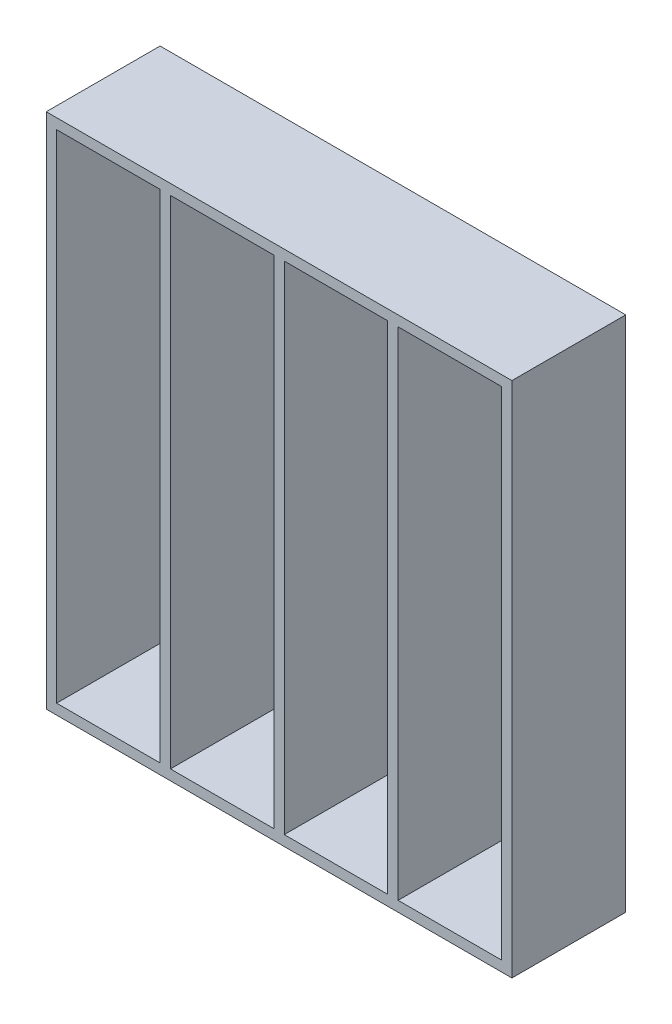
ISO-10303-21;
HEADER;
FILE_DESCRIPTION(('STEP AP214'),'2;1');
FILE_NAME('part.step','',(''),(''),'','','');
FILE_SCHEMA(('AUTOMOTIVE_DESIGN { 1 0 10303 214 1 1 1 1 }'));
ENDSEC;
DATA;
#1=APPLICATION_CONTEXT('core data for automotive mechanical design processes');
#2=APPLICATION_PROTOCOL_DEFINITION('international standard','automotive_design',2000,#1);
#3=PRODUCT_CONTEXT('',#1,'mechanical');
#4=PRODUCT('Part','Part','',(#3));
#5=PRODUCT_RELATED_PRODUCT_CATEGORY('part','',(#4));
#6=PRODUCT_DEFINITION_FORMATION('','',#4);
#7=PRODUCT_DEFINITION_CONTEXT('part definition',#1,'design');
#8=PRODUCT_DEFINITION('design','',#6,#7);
#9=PRODUCT_DEFINITION_SHAPE('','',#8);
#10=(LENGTH_UNIT() NAMED_UNIT(*) SI_UNIT(.MILLI.,.METRE.));
#11=(NAMED_UNIT(*) PLANE_ANGLE_UNIT() SI_UNIT($,.RADIAN.));
#12=(NAMED_UNIT(*) SI_UNIT($,.STERADIAN.) SOLID_ANGLE_UNIT());
#13=UNCERTAINTY_MEASURE_WITH_UNIT(LENGTH_MEASURE(1.E-05),#10,'distance_accuracy_value','');
#14=(GEOMETRIC_REPRESENTATION_CONTEXT(3) GLOBAL_UNCERTAINTY_ASSIGNED_CONTEXT((#13)) GLOBAL_UNIT_ASSIGNED_CONTEXT((#10,
#11,#12)) REPRESENTATION_CONTEXT('',''));
#15=CARTESIAN_POINT('',(0.,0.,0.));
#16=DIRECTION('',(0.,0.,1.));
#17=DIRECTION('',(1.,0.,0.));
#18=AXIS2_PLACEMENT_3D('',#15,#16,#17);
#19=CARTESIAN_POINT('',(0.,0.,11.));
#20=DIRECTION('',(-1.,0.,0.));
#21=DIRECTION('',(0.,0.,1.));
#22=AXIS2_PLACEMENT_3D('',#19,#20,#21);
#23=PLANE('',#22);
#24=DIRECTION('',(0.,1.,0.));
#25=VECTOR('',#24,1.);
#26=CARTESIAN_POINT('',(0.,0.,0.));
#27=LINE('',#26,#25);
#28=CARTESIAN_POINT('',(0.,0.,0.));
#29=VERTEX_POINT('',#28);
#30=CARTESIAN_POINT('',(0.,50.,0.));
#31=VERTEX_POINT('',#30);
#32=EDGE_CURVE('E293',#29,#31,#27,.T.);
#33=ORIENTED_EDGE('',*,*,#32,.T.);
#34=DIRECTION('',(0.,0.,-1.));
#35=VECTOR('',#34,1.);
#36=CARTESIAN_POINT('',(0.,50.,11.));
#37=LINE('',#36,#35);
#38=CARTESIAN_POINT('',(0.,50.,11.));
#39=VERTEX_POINT('',#38);
#40=EDGE_CURVE('E11',#39,#31,#37,.T.);
#41=ORIENTED_EDGE('',*,*,#40,.F.);
#42=DIRECTION('',(0.,1.,0.));
#43=VECTOR('',#42,1.);
#44=CARTESIAN_POINT('',(0.,0.,11.));
#45=LINE('',#44,#43);
#46=CARTESIAN_POINT('',(0.,0.,11.));
#47=VERTEX_POINT('',#46);
#48=EDGE_CURVE('E300',#47,#39,#45,.T.);
#49=ORIENTED_EDGE('',*,*,#48,.F.);
#50=DIRECTION('',(0.,0.,-1.));
#51=VECTOR('',#50,1.);
#52=CARTESIAN_POINT('',(0.,0.,11.));
#53=LINE('',#52,#51);
#54=EDGE_CURVE('E310',#47,#29,#53,.T.);
#55=ORIENTED_EDGE('',*,*,#54,.T.);
#56=EDGE_LOOP('',(#33,#41,#49,#55));
#57=FACE_BOUND('',#56,.T.);
#58=ADVANCED_FACE('F31',(#57),#23,.F.);
#59=CARTESIAN_POINT('',(0.,50.,11.));
#60=DIRECTION('',(0.,-1.,0.));
#61=DIRECTION('',(1.,0.,0.));
#62=AXIS2_PLACEMENT_3D('',#59,#60,#61);
#63=PLANE('',#62);
#64=DIRECTION('',(-1.,0.,0.));
#65=VECTOR('',#64,1.);
#66=CARTESIAN_POINT('',(0.,50.,0.));
#67=LINE('',#66,#65);
#68=CARTESIAN_POINT('',(-45.,50.,0.));
#69=VERTEX_POINT('',#68);
#70=EDGE_CURVE('E313',#31,#69,#67,.T.);
#71=ORIENTED_EDGE('',*,*,#70,.T.);
#72=DIRECTION('',(0.,0.,-1.));
#73=VECTOR('',#72,1.);
#74=CARTESIAN_POINT('',(-45.,50.,11.));
#75=LINE('',#74,#73);
#76=CARTESIAN_POINT('',(-45.,50.,11.));
#77=VERTEX_POINT('',#76);
#78=EDGE_CURVE('E38',#77,#69,#75,.T.);
#79=ORIENTED_EDGE('',*,*,#78,.F.);
#80=DIRECTION('',(-1.,0.,0.));
#81=VECTOR('',#80,1.);
#82=CARTESIAN_POINT('',(0.,50.,11.));
#83=LINE('',#82,#81);
#84=EDGE_CURVE('E303',#39,#77,#83,.T.);
#85=ORIENTED_EDGE('',*,*,#84,.F.);
#86=ORIENTED_EDGE('',*,*,#40,.T.);
#87=EDGE_LOOP('',(#71,#79,#85,#86));
#88=FACE_BOUND('',#87,.T.);
#89=ADVANCED_FACE('F343',(#88),#63,.F.);
#90=CARTESIAN_POINT('',(-45.,0.,11.));
#91=DIRECTION('',(1.,0.,0.));
#92=DIRECTION('',(0.,0.,-1.));
#93=AXIS2_PLACEMENT_3D('',#90,#91,#92);
#94=PLANE('',#93);
#95=DIRECTION('',(0.,-1.,0.));
#96=VECTOR('',#95,1.);
#97=CARTESIAN_POINT('',(-45.,0.,0.));
#98=LINE('',#97,#96);
#99=CARTESIAN_POINT('',(-45.,0.,0.));
#100=VERTEX_POINT('',#99);
#101=EDGE_CURVE('E315',#69,#100,#98,.T.);
#102=ORIENTED_EDGE('',*,*,#101,.T.);
#103=DIRECTION('',(0.,0.,-1.));
#104=VECTOR('',#103,1.);
#105=CARTESIAN_POINT('',(-45.,0.,11.));
#106=LINE('',#105,#104);
#107=CARTESIAN_POINT('',(-45.,0.,11.));
#108=VERTEX_POINT('',#107);
#109=EDGE_CURVE('E320',#108,#100,#106,.T.);
#110=ORIENTED_EDGE('',*,*,#109,.F.);
#111=DIRECTION('',(0.,-1.,0.));
#112=VECTOR('',#111,1.);
#113=CARTESIAN_POINT('',(-45.,0.,11.));
#114=LINE('',#113,#112);
#115=EDGE_CURVE('E306',#77,#108,#114,.T.);
#116=ORIENTED_EDGE('',*,*,#115,.F.);
#117=ORIENTED_EDGE('',*,*,#78,.T.);
#118=EDGE_LOOP('',(#102,#110,#116,#117));
#119=FACE_BOUND('',#118,.T.);
#120=ADVANCED_FACE('F327',(#119),#94,.F.);
#121=CARTESIAN_POINT('',(0.,0.,11.));
#122=DIRECTION('',(0.,1.,0.));
#123=DIRECTION('',(-1.,0.,0.));
#124=AXIS2_PLACEMENT_3D('',#121,#122,#123);
#125=PLANE('',#124);
#126=DIRECTION('',(1.,0.,0.));
#127=VECTOR('',#126,1.);
#128=CARTESIAN_POINT('',(0.,0.,0.));
#129=LINE('',#128,#127);
#130=EDGE_CURVE('E304',#100,#29,#129,.T.);
#131=ORIENTED_EDGE('',*,*,#130,.T.);
#132=ORIENTED_EDGE('',*,*,#54,.F.);
#133=DIRECTION('',(1.,0.,0.));
#134=VECTOR('',#133,1.);
#135=CARTESIAN_POINT('',(0.,0.,11.));
#136=LINE('',#135,#134);
#137=EDGE_CURVE('E308',#108,#47,#136,.T.);
#138=ORIENTED_EDGE('',*,*,#137,.F.);
#139=ORIENTED_EDGE('',*,*,#109,.T.);
#140=EDGE_LOOP('',(#131,#132,#138,#139));
#141=FACE_BOUND('',#140,.T.);
#142=ADVANCED_FACE('F336',(#141),#125,.F.);
#143=CARTESIAN_POINT('',(0.,0.,11.));
#144=DIRECTION('',(0.,0.,1.));
#145=DIRECTION('',(1.,0.,0.));
#146=AXIS2_PLACEMENT_3D('',#143,#144,#145);
#147=PLANE('',#146);
#148=DIRECTION('',(0.,-1.,0.));
#149=VECTOR('',#148,1.);
#150=CARTESIAN_POINT('',(-11.,49.,11.));
#151=LINE('',#150,#149);
#152=CARTESIAN_POINT('',(-11.,49.,11.));
#153=VERTEX_POINT('',#152);
#154=CARTESIAN_POINT('',(-11.,0.999999999999995,11.));
#155=VERTEX_POINT('',#154);
#156=EDGE_CURVE('E45',#153,#155,#151,.T.);
#157=ORIENTED_EDGE('',*,*,#156,.F.);
#158=DIRECTION('',(-1.,0.,0.));
#159=VECTOR('',#158,1.);
#160=CARTESIAN_POINT('',(-11.,49.,11.));
#161=LINE('',#160,#159);
#162=CARTESIAN_POINT('',(-0.999999999999992,49.,11.));
#163=VERTEX_POINT('',#162);
#164=EDGE_CURVE('E187',#163,#153,#161,.T.);
#165=ORIENTED_EDGE('',*,*,#164,.F.);
#166=DIRECTION('',(0.,1.,0.));
#167=VECTOR('',#166,1.);
#168=CARTESIAN_POINT('',(-0.999999999999992,49.,11.));
#169=LINE('',#168,#167);
#170=CARTESIAN_POINT('',(-0.999999999999987,0.999999999999994,11.));
#171=VERTEX_POINT('',#170);
#172=EDGE_CURVE('E190',#171,#163,#169,.T.);
#173=ORIENTED_EDGE('',*,*,#172,.F.);
#174=DIRECTION('',(1.,0.,0.));
#175=VECTOR('',#174,1.);
#176=CARTESIAN_POINT('',(-11.,0.999999999999995,11.));
#177=LINE('',#176,#175);
#178=EDGE_CURVE('E196',#155,#171,#177,.T.);
#179=ORIENTED_EDGE('',*,*,#178,.F.);
#180=EDGE_LOOP('',(#157,#165,#173,#179));
#181=FACE_BOUND('',#180,.T.);
#182=DIRECTION('',(0.,-1.,0.));
#183=VECTOR('',#182,1.);
#184=CARTESIAN_POINT('',(-22.,49.,11.));
#185=LINE('',#184,#183);
#186=CARTESIAN_POINT('',(-22.,49.,11.));
#187=VERTEX_POINT('',#186);
#188=CARTESIAN_POINT('',(-22.,0.999999999999995,11.));
#189=VERTEX_POINT('',#188);
#190=EDGE_CURVE('E53',#187,#189,#185,.T.);
#191=ORIENTED_EDGE('',*,*,#190,.F.);
#192=DIRECTION('',(-1.,0.,0.));
#193=VECTOR('',#192,1.);
#194=CARTESIAN_POINT('',(-22.,49.,11.));
#195=LINE('',#194,#193);
#196=CARTESIAN_POINT('',(-12.,49.,11.));
#197=VERTEX_POINT('',#196);
#198=EDGE_CURVE('E209',#197,#187,#195,.T.);
#199=ORIENTED_EDGE('',*,*,#198,.F.);
#200=DIRECTION('',(0.,1.,0.));
#201=VECTOR('',#200,1.);
#202=CARTESIAN_POINT('',(-12.,49.,11.));
#203=LINE('',#202,#201);
#204=CARTESIAN_POINT('',(-12.,0.999999999999995,11.));
#205=VERTEX_POINT('',#204);
#206=EDGE_CURVE('E223',#205,#197,#203,.T.);
#207=ORIENTED_EDGE('',*,*,#206,.F.);
#208=DIRECTION('',(1.,0.,0.));
#209=VECTOR('',#208,1.);
#210=CARTESIAN_POINT('',(-22.,0.999999999999995,11.));
#211=LINE('',#210,#209);
#212=EDGE_CURVE('E220',#189,#205,#211,.T.);
#213=ORIENTED_EDGE('',*,*,#212,.F.);
#214=EDGE_LOOP('',(#191,#199,#207,#213));
#215=FACE_BOUND('',#214,.T.);
#216=DIRECTION('',(0.,-1.,0.));
#217=VECTOR('',#216,1.);
#218=CARTESIAN_POINT('',(-33.,49.,11.));
#219=LINE('',#218,#217);
#220=CARTESIAN_POINT('',(-33.,49.,11.));
#221=VERTEX_POINT('',#220);
#222=CARTESIAN_POINT('',(-33.,0.999999999999994,11.));
#223=VERTEX_POINT('',#222);
#224=EDGE_CURVE('E230',#221,#223,#219,.T.);
#225=ORIENTED_EDGE('',*,*,#224,.F.);
#226=DIRECTION('',(-1.,0.,0.));
#227=VECTOR('',#226,1.);
#228=CARTESIAN_POINT('',(-33.,49.,11.));
#229=LINE('',#228,#227);
#230=CARTESIAN_POINT('',(-23.,49.,11.));
#231=VERTEX_POINT('',#230);
#232=EDGE_CURVE('E240',#231,#221,#229,.T.);
#233=ORIENTED_EDGE('',*,*,#232,.F.);
#234=DIRECTION('',(0.,1.,0.));
#235=VECTOR('',#234,1.);
#236=CARTESIAN_POINT('',(-23.,49.,11.));
#237=LINE('',#236,#235);
#238=CARTESIAN_POINT('',(-23.,0.999999999999995,11.));
#239=VERTEX_POINT('',#238);
#240=EDGE_CURVE('E254',#239,#231,#237,.T.);
#241=ORIENTED_EDGE('',*,*,#240,.F.);
#242=DIRECTION('',(1.,0.,0.));
#243=VECTOR('',#242,1.);
#244=CARTESIAN_POINT('',(-33.,0.999999999999994,11.));
#245=LINE('',#244,#243);
#246=EDGE_CURVE('E251',#223,#239,#245,.T.);
#247=ORIENTED_EDGE('',*,*,#246,.F.);
#248=EDGE_LOOP('',(#225,#233,#241,#247));
#249=FACE_BOUND('',#248,.T.);
#250=DIRECTION('',(0.,-1.,0.));
#251=VECTOR('',#250,1.);
#252=CARTESIAN_POINT('',(-44.,49.,11.));
#253=LINE('',#252,#251);
#254=CARTESIAN_POINT('',(-44.,49.,11.));
#255=VERTEX_POINT('',#254);
#256=CARTESIAN_POINT('',(-44.,0.999999999999994,11.));
#257=VERTEX_POINT('',#256);
#258=EDGE_CURVE('E261',#255,#257,#253,.T.);
#259=ORIENTED_EDGE('',*,*,#258,.F.);
#260=DIRECTION('',(-1.,0.,0.));
#261=VECTOR('',#260,1.);
#262=CARTESIAN_POINT('',(-44.,49.,11.));
#263=LINE('',#262,#261);
#264=CARTESIAN_POINT('',(-34.,49.,11.));
#265=VERTEX_POINT('',#264);
#266=EDGE_CURVE('E272',#265,#255,#263,.T.);
#267=ORIENTED_EDGE('',*,*,#266,.F.);
#268=DIRECTION('',(0.,1.,0.));
#269=VECTOR('',#268,1.);
#270=CARTESIAN_POINT('',(-34.,49.,11.));
#271=LINE('',#270,#269);
#272=CARTESIAN_POINT('',(-34.,0.999999999999995,11.));
#273=VERTEX_POINT('',#272);
#274=EDGE_CURVE('E286',#273,#265,#271,.T.);
#275=ORIENTED_EDGE('',*,*,#274,.F.);
#276=DIRECTION('',(1.,0.,0.));
#277=VECTOR('',#276,1.);
#278=CARTESIAN_POINT('',(-44.,0.999999999999994,11.));
#279=LINE('',#278,#277);
#280=EDGE_CURVE('E283',#257,#273,#279,.T.);
#281=ORIENTED_EDGE('',*,*,#280,.F.);
#282=EDGE_LOOP('',(#259,#267,#275,#281));
#283=FACE_BOUND('',#282,.T.);
#284=ORIENTED_EDGE('',*,*,#48,.T.);
#285=ORIENTED_EDGE('',*,*,#84,.T.);
#286=ORIENTED_EDGE('',*,*,#115,.T.);
#287=ORIENTED_EDGE('',*,*,#137,.T.);
#288=EDGE_LOOP('',(#284,#285,#286,#287));
#289=FACE_BOUND('',#288,.T.);
#290=ADVANCED_FACE('F342',(#181,#215,#249,#283,#289),#147,.T.);
#291=CARTESIAN_POINT('',(0.,0.,0.));
#292=DIRECTION('',(0.,0.,1.));
#293=DIRECTION('',(1.,0.,0.));
#294=AXIS2_PLACEMENT_3D('',#291,#292,#293);
#295=PLANE('',#294);
#296=ORIENTED_EDGE('',*,*,#32,.F.);
#297=ORIENTED_EDGE('',*,*,#130,.F.);
#298=ORIENTED_EDGE('',*,*,#101,.F.);
#299=ORIENTED_EDGE('',*,*,#70,.F.);
#300=EDGE_LOOP('',(#296,#297,#298,#299));
#301=FACE_BOUND('',#300,.T.);
#302=ADVANCED_FACE('F333',(#301),#295,.F.);
#303=CARTESIAN_POINT('',(-44.,49.,0.999999999999999));
#304=DIRECTION('',(-1.,0.,0.));
#305=DIRECTION('',(0.,-1.,0.));
#306=AXIS2_PLACEMENT_3D('',#303,#304,#305);
#307=PLANE('',#306);
#308=ORIENTED_EDGE('',*,*,#258,.T.);
#309=DIRECTION('',(0.,0.,1.));
#310=VECTOR('',#309,1.);
#311=CARTESIAN_POINT('',(-44.,0.999999999999994,0.999999999999999));
#312=LINE('',#311,#310);
#313=CARTESIAN_POINT('',(-44.,0.999999999999994,0.999999999999999));
#314=VERTEX_POINT('',#313);
#315=EDGE_CURVE('E281',#314,#257,#312,.T.);
#316=ORIENTED_EDGE('',*,*,#315,.F.);
#317=DIRECTION('',(0.,-1.,0.));
#318=VECTOR('',#317,1.);
#319=CARTESIAN_POINT('',(-44.,49.,0.999999999999999));
#320=LINE('',#319,#318);
#321=CARTESIAN_POINT('',(-44.,49.,0.999999999999999));
#322=VERTEX_POINT('',#321);
#323=EDGE_CURVE('E268',#322,#314,#320,.T.);
#324=ORIENTED_EDGE('',*,*,#323,.F.);
#325=DIRECTION('',(0.,0.,1.));
#326=VECTOR('',#325,1.);
#327=CARTESIAN_POINT('',(-44.,49.,0.999999999999999));
#328=LINE('',#327,#326);
#329=EDGE_CURVE('E291',#322,#255,#328,.T.);
#330=ORIENTED_EDGE('',*,*,#329,.T.);
#331=EDGE_LOOP('',(#308,#316,#324,#330));
#332=FACE_BOUND('',#331,.T.);
#333=ADVANCED_FACE('F355',(#332),#307,.F.);
#334=CARTESIAN_POINT('',(-44.,49.,0.999999999999999));
#335=DIRECTION('',(0.,1.,0.));
#336=DIRECTION('',(0.,0.,1.));
#337=AXIS2_PLACEMENT_3D('',#334,#335,#336);
#338=PLANE('',#337);
#339=ORIENTED_EDGE('',*,*,#266,.T.);
#340=ORIENTED_EDGE('',*,*,#329,.F.);
#341=DIRECTION('',(-1.,0.,0.));
#342=VECTOR('',#341,1.);
#343=CARTESIAN_POINT('',(-44.,49.,0.999999999999999));
#344=LINE('',#343,#342);
#345=CARTESIAN_POINT('',(-34.,49.,0.999999999999999));
#346=VERTEX_POINT('',#345);
#347=EDGE_CURVE('E278',#346,#322,#344,.T.);
#348=ORIENTED_EDGE('',*,*,#347,.F.);
#349=DIRECTION('',(0.,0.,1.));
#350=VECTOR('',#349,1.);
#351=CARTESIAN_POINT('',(-34.,49.,0.999999999999999));
#352=LINE('',#351,#350);
#353=EDGE_CURVE('E294',#346,#265,#352,.T.);
#354=ORIENTED_EDGE('',*,*,#353,.T.);
#355=EDGE_LOOP('',(#339,#340,#348,#354));
#356=FACE_BOUND('',#355,.T.);
#357=ADVANCED_FACE('F361',(#356),#338,.F.);
#358=CARTESIAN_POINT('',(-34.,49.,0.999999999999999));
#359=DIRECTION('',(1.,0.,0.));
#360=DIRECTION('',(0.,1.,0.));
#361=AXIS2_PLACEMENT_3D('',#358,#359,#360);
#362=PLANE('',#361);
#363=ORIENTED_EDGE('',*,*,#274,.T.);
#364=ORIENTED_EDGE('',*,*,#353,.F.);
#365=DIRECTION('',(0.,1.,0.));
#366=VECTOR('',#365,1.);
#367=CARTESIAN_POINT('',(-34.,49.,0.999999999999999));
#368=LINE('',#367,#366);
#369=CARTESIAN_POINT('',(-34.,0.999999999999995,0.999999999999999));
#370=VERTEX_POINT('',#369);
#371=EDGE_CURVE('E275',#370,#346,#368,.T.);
#372=ORIENTED_EDGE('',*,*,#371,.F.);
#373=DIRECTION('',(0.,0.,1.));
#374=VECTOR('',#373,1.);
#375=CARTESIAN_POINT('',(-34.,0.999999999999995,0.999999999999999));
#376=LINE('',#375,#374);
#377=EDGE_CURVE('E296',#370,#273,#376,.T.);
#378=ORIENTED_EDGE('',*,*,#377,.T.);
#379=EDGE_LOOP('',(#363,#364,#372,#378));
#380=FACE_BOUND('',#379,.T.);
#381=ADVANCED_FACE('F367',(#380),#362,.F.);
#382=CARTESIAN_POINT('',(-44.,0.999999999999994,0.999999999999999));
#383=DIRECTION('',(0.,-1.,0.));
#384=DIRECTION('',(1.,0.,0.));
#385=AXIS2_PLACEMENT_3D('',#382,#383,#384);
#386=PLANE('',#385);
#387=ORIENTED_EDGE('',*,*,#280,.T.);
#388=ORIENTED_EDGE('',*,*,#377,.F.);
#389=DIRECTION('',(1.,0.,0.));
#390=VECTOR('',#389,1.);
#391=CARTESIAN_POINT('',(-44.,0.999999999999994,0.999999999999999));
#392=LINE('',#391,#390);
#393=EDGE_CURVE('E271',#314,#370,#392,.T.);
#394=ORIENTED_EDGE('',*,*,#393,.F.);
#395=ORIENTED_EDGE('',*,*,#315,.T.);
#396=EDGE_LOOP('',(#387,#388,#394,#395));
#397=FACE_BOUND('',#396,.T.);
#398=ADVANCED_FACE('F363',(#397),#386,.F.);
#399=CARTESIAN_POINT('',(-44.,0.999999999999994,0.999999999999999));
#400=DIRECTION('',(0.,0.,1.));
#401=DIRECTION('',(1.,0.,0.));
#402=AXIS2_PLACEMENT_3D('',#399,#400,#401);
#403=PLANE('',#402);
#404=ORIENTED_EDGE('',*,*,#323,.T.);
#405=ORIENTED_EDGE('',*,*,#393,.T.);
#406=ORIENTED_EDGE('',*,*,#371,.T.);
#407=ORIENTED_EDGE('',*,*,#347,.T.);
#408=EDGE_LOOP('',(#404,#405,#406,#407));
#409=FACE_BOUND('',#408,.T.);
#410=ADVANCED_FACE('F366',(#409),#403,.T.);
#411=CARTESIAN_POINT('',(-33.,49.,0.999999999999999));
#412=DIRECTION('',(-1.,0.,0.));
#413=DIRECTION('',(0.,-1.,0.));
#414=AXIS2_PLACEMENT_3D('',#411,#412,#413);
#415=PLANE('',#414);
#416=ORIENTED_EDGE('',*,*,#224,.T.);
#417=DIRECTION('',(0.,0.,1.));
#418=VECTOR('',#417,1.);
#419=CARTESIAN_POINT('',(-33.,0.999999999999994,0.999999999999999));
#420=LINE('',#419,#418);
#421=CARTESIAN_POINT('',(-33.,0.999999999999994,0.999999999999999));
#422=VERTEX_POINT('',#421);
#423=EDGE_CURVE('E249',#422,#223,#420,.T.);
#424=ORIENTED_EDGE('',*,*,#423,.F.);
#425=DIRECTION('',(0.,-1.,0.));
#426=VECTOR('',#425,1.);
#427=CARTESIAN_POINT('',(-33.,49.,0.999999999999999));
#428=LINE('',#427,#426);
#429=CARTESIAN_POINT('',(-33.,49.,0.999999999999999));
#430=VERTEX_POINT('',#429);
#431=EDGE_CURVE('E236',#430,#422,#428,.T.);
#432=ORIENTED_EDGE('',*,*,#431,.F.);
#433=DIRECTION('',(0.,0.,1.));
#434=VECTOR('',#433,1.);
#435=CARTESIAN_POINT('',(-33.,49.,0.999999999999999));
#436=LINE('',#435,#434);
#437=EDGE_CURVE('E259',#430,#221,#436,.T.);
#438=ORIENTED_EDGE('',*,*,#437,.T.);
#439=EDGE_LOOP('',(#416,#424,#432,#438));
#440=FACE_BOUND('',#439,.T.);
#441=ADVANCED_FACE('F377',(#440),#415,.F.);
#442=CARTESIAN_POINT('',(-33.,49.,0.999999999999999));
#443=DIRECTION('',(0.,1.,0.));
#444=DIRECTION('',(0.,0.,1.));
#445=AXIS2_PLACEMENT_3D('',#442,#443,#444);
#446=PLANE('',#445);
#447=ORIENTED_EDGE('',*,*,#232,.T.);
#448=ORIENTED_EDGE('',*,*,#437,.F.);
#449=DIRECTION('',(-1.,0.,0.));
#450=VECTOR('',#449,1.);
#451=CARTESIAN_POINT('',(-33.,49.,0.999999999999999));
#452=LINE('',#451,#450);
#453=CARTESIAN_POINT('',(-23.,49.,0.999999999999999));
#454=VERTEX_POINT('',#453);
#455=EDGE_CURVE('E246',#454,#430,#452,.T.);
#456=ORIENTED_EDGE('',*,*,#455,.F.);
#457=DIRECTION('',(0.,0.,1.));
#458=VECTOR('',#457,1.);
#459=CARTESIAN_POINT('',(-23.,49.,0.999999999999999));
#460=LINE('',#459,#458);
#461=EDGE_CURVE('E262',#454,#231,#460,.T.);
#462=ORIENTED_EDGE('',*,*,#461,.T.);
#463=EDGE_LOOP('',(#447,#448,#456,#462));
#464=FACE_BOUND('',#463,.T.);
#465=ADVANCED_FACE('F381',(#464),#446,.F.);
#466=CARTESIAN_POINT('',(-23.,49.,0.999999999999999));
#467=DIRECTION('',(1.,0.,0.));
#468=DIRECTION('',(0.,1.,0.));
#469=AXIS2_PLACEMENT_3D('',#466,#467,#468);
#470=PLANE('',#469);
#471=ORIENTED_EDGE('',*,*,#240,.T.);
#472=ORIENTED_EDGE('',*,*,#461,.F.);
#473=DIRECTION('',(0.,1.,0.));
#474=VECTOR('',#473,1.);
#475=CARTESIAN_POINT('',(-23.,49.,0.999999999999999));
#476=LINE('',#475,#474);
#477=CARTESIAN_POINT('',(-23.,0.999999999999995,0.999999999999999));
#478=VERTEX_POINT('',#477);
#479=EDGE_CURVE('E243',#478,#454,#476,.T.);
#480=ORIENTED_EDGE('',*,*,#479,.F.);
#481=DIRECTION('',(0.,0.,1.));
#482=VECTOR('',#481,1.);
#483=CARTESIAN_POINT('',(-23.,0.999999999999995,0.999999999999999));
#484=LINE('',#483,#482);
#485=EDGE_CURVE('E264',#478,#239,#484,.T.);
#486=ORIENTED_EDGE('',*,*,#485,.T.);
#487=EDGE_LOOP('',(#471,#472,#480,#486));
#488=FACE_BOUND('',#487,.T.);
#489=ADVANCED_FACE('F387',(#488),#470,.F.);
#490=CARTESIAN_POINT('',(-33.,0.999999999999994,0.999999999999999));
#491=DIRECTION('',(0.,-1.,0.));
#492=DIRECTION('',(1.,0.,0.));
#493=AXIS2_PLACEMENT_3D('',#490,#491,#492);
#494=PLANE('',#493);
#495=ORIENTED_EDGE('',*,*,#246,.T.);
#496=ORIENTED_EDGE('',*,*,#485,.F.);
#497=DIRECTION('',(1.,0.,0.));
#498=VECTOR('',#497,1.);
#499=CARTESIAN_POINT('',(-33.,0.999999999999994,0.999999999999999));
#500=LINE('',#499,#498);
#501=EDGE_CURVE('E239',#422,#478,#500,.T.);
#502=ORIENTED_EDGE('',*,*,#501,.F.);
#503=ORIENTED_EDGE('',*,*,#423,.T.);
#504=EDGE_LOOP('',(#495,#496,#502,#503));
#505=FACE_BOUND('',#504,.T.);
#506=ADVANCED_FACE('F383',(#505),#494,.F.);
#507=CARTESIAN_POINT('',(-33.,0.999999999999994,0.999999999999999));
#508=DIRECTION('',(0.,0.,1.));
#509=DIRECTION('',(1.,0.,0.));
#510=AXIS2_PLACEMENT_3D('',#507,#508,#509);
#511=PLANE('',#510);
#512=ORIENTED_EDGE('',*,*,#431,.T.);
#513=ORIENTED_EDGE('',*,*,#501,.T.);
#514=ORIENTED_EDGE('',*,*,#479,.T.);
#515=ORIENTED_EDGE('',*,*,#455,.T.);
#516=EDGE_LOOP('',(#512,#513,#514,#515));
#517=FACE_BOUND('',#516,.T.);
#518=ADVANCED_FACE('F386',(#517),#511,.T.);
#519=CARTESIAN_POINT('',(-22.,49.,0.999999999999999));
#520=DIRECTION('',(-1.,0.,0.));
#521=DIRECTION('',(0.,-1.,0.));
#522=AXIS2_PLACEMENT_3D('',#519,#520,#521);
#523=PLANE('',#522);
#524=ORIENTED_EDGE('',*,*,#190,.T.);
#525=DIRECTION('',(0.,0.,1.));
#526=VECTOR('',#525,1.);
#527=CARTESIAN_POINT('',(-22.,0.999999999999995,0.999999999999999));
#528=LINE('',#527,#526);
#529=CARTESIAN_POINT('',(-22.,0.999999999999995,0.999999999999999));
#530=VERTEX_POINT('',#529);
#531=EDGE_CURVE('E218',#530,#189,#528,.T.);
#532=ORIENTED_EDGE('',*,*,#531,.F.);
#533=DIRECTION('',(0.,-1.,0.));
#534=VECTOR('',#533,1.);
#535=CARTESIAN_POINT('',(-22.,49.,0.999999999999999));
#536=LINE('',#535,#534);
#537=CARTESIAN_POINT('',(-22.,49.,0.999999999999999));
#538=VERTEX_POINT('',#537);
#539=EDGE_CURVE('E205',#538,#530,#536,.T.);
#540=ORIENTED_EDGE('',*,*,#539,.F.);
#541=DIRECTION('',(0.,0.,1.));
#542=VECTOR('',#541,1.);
#543=CARTESIAN_POINT('',(-22.,49.,0.999999999999999));
#544=LINE('',#543,#542);
#545=EDGE_CURVE('E228',#538,#187,#544,.T.);
#546=ORIENTED_EDGE('',*,*,#545,.T.);
#547=EDGE_LOOP('',(#524,#532,#540,#546));
#548=FACE_BOUND('',#547,.T.);
#549=ADVANCED_FACE('F397',(#548),#523,.F.);
#550=CARTESIAN_POINT('',(-22.,49.,0.999999999999999));
#551=DIRECTION('',(0.,1.,0.));
#552=DIRECTION('',(0.,0.,1.));
#553=AXIS2_PLACEMENT_3D('',#550,#551,#552);
#554=PLANE('',#553);
#555=ORIENTED_EDGE('',*,*,#198,.T.);
#556=ORIENTED_EDGE('',*,*,#545,.F.);
#557=DIRECTION('',(-1.,0.,0.));
#558=VECTOR('',#557,1.);
#559=CARTESIAN_POINT('',(-22.,49.,0.999999999999999));
#560=LINE('',#559,#558);
#561=CARTESIAN_POINT('',(-12.,49.,0.999999999999999));
#562=VERTEX_POINT('',#561);
#563=EDGE_CURVE('E215',#562,#538,#560,.T.);
#564=ORIENTED_EDGE('',*,*,#563,.F.);
#565=DIRECTION('',(0.,0.,1.));
#566=VECTOR('',#565,1.);
#567=CARTESIAN_POINT('',(-12.,49.,0.999999999999999));
#568=LINE('',#567,#566);
#569=EDGE_CURVE('E231',#562,#197,#568,.T.);
#570=ORIENTED_EDGE('',*,*,#569,.T.);
#571=EDGE_LOOP('',(#555,#556,#564,#570));
#572=FACE_BOUND('',#571,.T.);
#573=ADVANCED_FACE('F401',(#572),#554,.F.);
#574=CARTESIAN_POINT('',(-12.,49.,0.999999999999999));
#575=DIRECTION('',(1.,0.,0.));
#576=DIRECTION('',(0.,1.,0.));
#577=AXIS2_PLACEMENT_3D('',#574,#575,#576);
#578=PLANE('',#577);
#579=ORIENTED_EDGE('',*,*,#206,.T.);
#580=ORIENTED_EDGE('',*,*,#569,.F.);
#581=DIRECTION('',(0.,1.,0.));
#582=VECTOR('',#581,1.);
#583=CARTESIAN_POINT('',(-12.,49.,0.999999999999999));
#584=LINE('',#583,#582);
#585=CARTESIAN_POINT('',(-12.,0.999999999999995,0.999999999999999));
#586=VERTEX_POINT('',#585);
#587=EDGE_CURVE('E212',#586,#562,#584,.T.);
#588=ORIENTED_EDGE('',*,*,#587,.F.);
#589=DIRECTION('',(0.,0.,1.));
#590=VECTOR('',#589,1.);
#591=CARTESIAN_POINT('',(-12.,0.999999999999995,0.999999999999999));
#592=LINE('',#591,#590);
#593=EDGE_CURVE('E233',#586,#205,#592,.T.);
#594=ORIENTED_EDGE('',*,*,#593,.T.);
#595=EDGE_LOOP('',(#579,#580,#588,#594));
#596=FACE_BOUND('',#595,.T.);
#597=ADVANCED_FACE('F406',(#596),#578,.F.);
#598=CARTESIAN_POINT('',(-22.,0.999999999999995,0.999999999999999));
#599=DIRECTION('',(0.,-1.,0.));
#600=DIRECTION('',(0.,0.,-1.));
#601=AXIS2_PLACEMENT_3D('',#598,#599,#600);
#602=PLANE('',#601);
#603=ORIENTED_EDGE('',*,*,#212,.T.);
#604=ORIENTED_EDGE('',*,*,#593,.F.);
#605=DIRECTION('',(1.,0.,0.));
#606=VECTOR('',#605,1.);
#607=CARTESIAN_POINT('',(-22.,0.999999999999995,0.999999999999999));
#608=LINE('',#607,#606);
#609=EDGE_CURVE('E208',#530,#586,#608,.T.);
#610=ORIENTED_EDGE('',*,*,#609,.F.);
#611=ORIENTED_EDGE('',*,*,#531,.T.);
#612=EDGE_LOOP('',(#603,#604,#610,#611));
#613=FACE_BOUND('',#612,.T.);
#614=ADVANCED_FACE('F402',(#613),#602,.F.);
#615=CARTESIAN_POINT('',(-22.,0.999999999999995,0.999999999999999));
#616=DIRECTION('',(0.,0.,1.));
#617=DIRECTION('',(1.,0.,0.));
#618=AXIS2_PLACEMENT_3D('',#615,#616,#617);
#619=PLANE('',#618);
#620=ORIENTED_EDGE('',*,*,#539,.T.);
#621=ORIENTED_EDGE('',*,*,#609,.T.);
#622=ORIENTED_EDGE('',*,*,#587,.T.);
#623=ORIENTED_EDGE('',*,*,#563,.T.);
#624=EDGE_LOOP('',(#620,#621,#622,#623));
#625=FACE_BOUND('',#624,.T.);
#626=ADVANCED_FACE('F405',(#625),#619,.T.);
#627=CARTESIAN_POINT('',(-11.,49.,0.999999999999999));
#628=DIRECTION('',(-1.,0.,0.));
#629=DIRECTION('',(0.,-1.,0.));
#630=AXIS2_PLACEMENT_3D('',#627,#628,#629);
#631=PLANE('',#630);
#632=ORIENTED_EDGE('',*,*,#156,.T.);
#633=DIRECTION('',(0.,0.,1.));
#634=VECTOR('',#633,1.);
#635=CARTESIAN_POINT('',(-11.,0.999999999999995,0.999999999999999));
#636=LINE('',#635,#634);
#637=CARTESIAN_POINT('',(-11.,0.999999999999995,0.999999999999999));
#638=VERTEX_POINT('',#637);
#639=EDGE_CURVE('E165',#638,#155,#636,.T.);
#640=ORIENTED_EDGE('',*,*,#639,.F.);
#641=DIRECTION('',(0.,-1.,0.));
#642=VECTOR('',#641,1.);
#643=CARTESIAN_POINT('',(-11.,49.,0.999999999999999));
#644=LINE('',#643,#642);
#645=CARTESIAN_POINT('',(-11.,49.,0.999999999999999));
#646=VERTEX_POINT('',#645);
#647=EDGE_CURVE('E169',#646,#638,#644,.T.);
#648=ORIENTED_EDGE('',*,*,#647,.F.);
#649=DIRECTION('',(0.,0.,1.));
#650=VECTOR('',#649,1.);
#651=CARTESIAN_POINT('',(-11.,49.,0.999999999999999));
#652=LINE('',#651,#650);
#653=EDGE_CURVE('E200',#646,#153,#652,.T.);
#654=ORIENTED_EDGE('',*,*,#653,.T.);
#655=EDGE_LOOP('',(#632,#640,#648,#654));
#656=FACE_BOUND('',#655,.T.);
#657=ADVANCED_FACE('F167',(#656),#631,.F.);
#658=CARTESIAN_POINT('',(-11.,49.,0.999999999999999));
#659=DIRECTION('',(0.,1.,0.));
#660=DIRECTION('',(-1.,0.,0.));
#661=AXIS2_PLACEMENT_3D('',#658,#659,#660);
#662=PLANE('',#661);
#663=ORIENTED_EDGE('',*,*,#164,.T.);
#664=ORIENTED_EDGE('',*,*,#653,.F.);
#665=DIRECTION('',(-1.,0.,0.));
#666=VECTOR('',#665,1.);
#667=CARTESIAN_POINT('',(-11.,49.,0.999999999999999));
#668=LINE('',#667,#666);
#669=CARTESIAN_POINT('',(-0.999999999999992,49.,0.999999999999999));
#670=VERTEX_POINT('',#669);
#671=EDGE_CURVE('E175',#670,#646,#668,.T.);
#672=ORIENTED_EDGE('',*,*,#671,.F.);
#673=DIRECTION('',(0.,0.,1.));
#674=VECTOR('',#673,1.);
#675=CARTESIAN_POINT('',(-0.999999999999992,49.,0.999999999999999));
#676=LINE('',#675,#674);
#677=EDGE_CURVE('E202',#670,#163,#676,.T.);
#678=ORIENTED_EDGE('',*,*,#677,.T.);
#679=EDGE_LOOP('',(#663,#664,#672,#678));
#680=FACE_BOUND('',#679,.T.);
#681=ADVANCED_FACE('F419',(#680),#662,.F.);
#682=CARTESIAN_POINT('',(-0.999999999999992,49.,0.999999999999999));
#683=DIRECTION('',(1.,0.,0.));
#684=DIRECTION('',(0.,1.,0.));
#685=AXIS2_PLACEMENT_3D('',#682,#683,#684);
#686=PLANE('',#685);
#687=ORIENTED_EDGE('',*,*,#172,.T.);
#688=ORIENTED_EDGE('',*,*,#677,.F.);
#689=DIRECTION('',(0.,1.,0.));
#690=VECTOR('',#689,1.);
#691=CARTESIAN_POINT('',(-0.999999999999992,49.,0.999999999999999));
#692=LINE('',#691,#690);
#693=CARTESIAN_POINT('',(-0.999999999999987,0.999999999999994,0.999999999999999));
#694=VERTEX_POINT('',#693);
#695=EDGE_CURVE('E183',#694,#670,#692,.T.);
#696=ORIENTED_EDGE('',*,*,#695,.F.);
#697=DIRECTION('',(0.,0.,1.));
#698=VECTOR('',#697,1.);
#699=CARTESIAN_POINT('',(-0.999999999999987,0.999999999999994,0.999999999999999));
#700=LINE('',#699,#698);
#701=EDGE_CURVE('E174',#694,#171,#700,.T.);
#702=ORIENTED_EDGE('',*,*,#701,.T.);
#703=EDGE_LOOP('',(#687,#688,#696,#702));
#704=FACE_BOUND('',#703,.T.);
#705=ADVANCED_FACE('F422',(#704),#686,.F.);
#706=CARTESIAN_POINT('',(-11.,0.999999999999995,0.999999999999999));
#707=DIRECTION('',(0.,-1.,0.));
#708=DIRECTION('',(1.,0.,0.));
#709=AXIS2_PLACEMENT_3D('',#706,#707,#708);
#710=PLANE('',#709);
#711=ORIENTED_EDGE('',*,*,#178,.T.);
#712=ORIENTED_EDGE('',*,*,#701,.F.);
#713=DIRECTION('',(1.,0.,0.));
#714=VECTOR('',#713,1.);
#715=CARTESIAN_POINT('',(-11.,0.999999999999995,0.999999999999999));
#716=LINE('',#715,#714);
#717=EDGE_CURVE('E178',#638,#694,#716,.T.);
#718=ORIENTED_EDGE('',*,*,#717,.F.);
#719=ORIENTED_EDGE('',*,*,#639,.T.);
#720=EDGE_LOOP('',(#711,#712,#718,#719));
#721=FACE_BOUND('',#720,.T.);
#722=ADVANCED_FACE('F179',(#721),#710,.F.);
#723=CARTESIAN_POINT('',(-11.,0.999999999999995,0.999999999999999));
#724=DIRECTION('',(0.,0.,1.));
#725=DIRECTION('',(1.,0.,0.));
#726=AXIS2_PLACEMENT_3D('',#723,#724,#725);
#727=PLANE('',#726);
#728=ORIENTED_EDGE('',*,*,#647,.T.);
#729=ORIENTED_EDGE('',*,*,#717,.T.);
#730=ORIENTED_EDGE('',*,*,#695,.T.);
#731=ORIENTED_EDGE('',*,*,#671,.T.);
#732=EDGE_LOOP('',(#728,#729,#730,#731));
#733=FACE_BOUND('',#732,.T.);
#734=ADVANCED_FACE('F185',(#733),#727,.T.);
#735=CLOSED_SHELL('',(#58,#89,#120,#142,#290,#302,#333,#357,#381,#398,#410,#441,#465,#489,#506,
#518,#549,#573,#597,#614,#626,#657,#681,#705,#722,#734));
#736=MANIFOLD_SOLID_BREP('B2',#735);
#737=ADVANCED_BREP_SHAPE_REPRESENTATION('',(#18,#736),#14);
#738=SHAPE_DEFINITION_REPRESENTATION(#9,#737);
ENDSEC;
END-ISO-10303-21;
